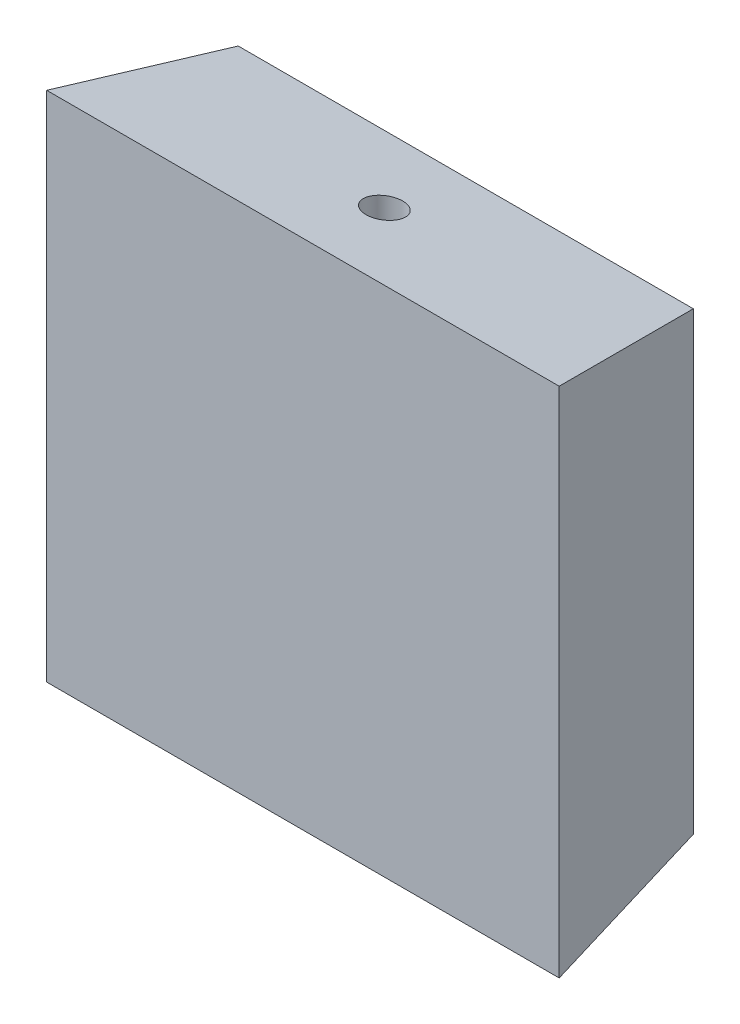
ISO-10303-21;
HEADER;
FILE_DESCRIPTION(('STEP AP214'),'2;1');
FILE_NAME('part.step','',(''),(''),'','','');
FILE_SCHEMA(('AUTOMOTIVE_DESIGN { 1 0 10303 214 1 1 1 1 }'));
ENDSEC;
DATA;
#1=APPLICATION_CONTEXT('core data for automotive mechanical design processes');
#2=APPLICATION_PROTOCOL_DEFINITION('international standard','automotive_design',2000,#1);
#3=PRODUCT_CONTEXT('',#1,'mechanical');
#4=PRODUCT('Part','Part','',(#3));
#5=PRODUCT_RELATED_PRODUCT_CATEGORY('part','',(#4));
#6=PRODUCT_DEFINITION_FORMATION('','',#4);
#7=PRODUCT_DEFINITION_CONTEXT('part definition',#1,'design');
#8=PRODUCT_DEFINITION('design','',#6,#7);
#9=PRODUCT_DEFINITION_SHAPE('','',#8);
#10=(LENGTH_UNIT() NAMED_UNIT(*) SI_UNIT(.MILLI.,.METRE.));
#11=(NAMED_UNIT(*) PLANE_ANGLE_UNIT() SI_UNIT($,.RADIAN.));
#12=(NAMED_UNIT(*) SI_UNIT($,.STERADIAN.) SOLID_ANGLE_UNIT());
#13=UNCERTAINTY_MEASURE_WITH_UNIT(LENGTH_MEASURE(1.E-05),#10,'distance_accuracy_value','');
#14=(GEOMETRIC_REPRESENTATION_CONTEXT(3) GLOBAL_UNCERTAINTY_ASSIGNED_CONTEXT((#13)) GLOBAL_UNIT_ASSIGNED_CONTEXT((#10,
#11,#12)) REPRESENTATION_CONTEXT('',''));
#15=CARTESIAN_POINT('',(0.,0.,0.));
#16=DIRECTION('',(0.,0.,1.));
#17=DIRECTION('',(1.,0.,0.));
#18=AXIS2_PLACEMENT_3D('',#15,#16,#17);
#19=CARTESIAN_POINT('',(20.701,-20.701,0.));
#20=DIRECTION('',(0.984807753012208,0.,-0.173648177666931));
#21=DIRECTION('',(-0.173648177666931,0.,-0.984807753012208));
#22=AXIS2_PLACEMENT_3D('',#19,#20,#21);
#23=PLANE('',#22);
#24=DIRECTION('',(0.,1.,0.));
#25=VECTOR('',#24,1.);
#26=CARTESIAN_POINT('',(20.701,-20.701,0.));
#27=LINE('',#26,#25);
#28=CARTESIAN_POINT('',(20.701,-20.701,0.));
#29=VERTEX_POINT('',#28);
#30=CARTESIAN_POINT('',(20.701,20.701,0.));
#31=VERTEX_POINT('',#30);
#32=EDGE_CURVE('E79',#29,#31,#27,.T.);
#33=ORIENTED_EDGE('',*,*,#32,.T.);
#34=DIRECTION('',(-0.171087869746036,-0.171087869746036,-0.970287525247814));
#35=VECTOR('',#34,1.);
#36=CARTESIAN_POINT('',(19.4891196080683,19.4891196080683,-6.87291523431365));
#37=LINE('',#36,#35);
#38=CARTESIAN_POINT('',(23.3134288073201,23.3134288073201,14.81582));
#39=VERTEX_POINT('',#38);
#40=EDGE_CURVE('E11',#39,#31,#37,.T.);
#41=ORIENTED_EDGE('',*,*,#40,.F.);
#42=DIRECTION('',(0.,-1.,0.));
#43=VECTOR('',#42,1.);
#44=CARTESIAN_POINT('',(23.3134288073201,0.,14.81582));
#45=LINE('',#44,#43);
#46=CARTESIAN_POINT('',(23.3134288073201,-23.3134288073201,14.81582));
#47=VERTEX_POINT('',#46);
#48=EDGE_CURVE('E98',#47,#39,#45,.F.);
#49=ORIENTED_EDGE('',*,*,#48,.F.);
#50=DIRECTION('',(-0.171087869746036,0.171087869746036,-0.970287525247814));
#51=VECTOR('',#50,1.);
#52=CARTESIAN_POINT('',(20.701,-20.701,0.));
#53=LINE('',#52,#51);
#54=EDGE_CURVE('E90',#47,#29,#53,.T.);
#55=ORIENTED_EDGE('',*,*,#54,.T.);
#56=EDGE_LOOP('',(#33,#41,#49,#55));
#57=FACE_BOUND('',#56,.T.);
#58=ADVANCED_FACE('F32',(#57),#23,.T.);
#59=CARTESIAN_POINT('',(-20.701,20.701,0.));
#60=DIRECTION('',(0.,0.984807753012208,-0.173648177666931));
#61=DIRECTION('',(0.,0.173648177666931,0.984807753012208));
#62=AXIS2_PLACEMENT_3D('',#59,#60,#61);
#63=PLANE('',#62);
#64=CARTESIAN_POINT('',(0.,22.00721440366,7.40791));
#65=DIRECTION('',(0.,0.984807753012208,-0.173648177666931));
#66=DIRECTION('',(0.,0.173648177666931,0.984807753012208));
#67=AXIS2_PLACEMENT_3D('',#64,#65,#66);
#68=ELLIPSE('',#67,1.69258923368705,1.666875);
#69=CARTESIAN_POINT('',(0.,22.3011294396285,9.074785));
#70=VERTEX_POINT('',#69);
#71=EDGE_CURVE('E36',#70,#70,#68,.F.);
#72=ORIENTED_EDGE('',*,*,#71,.T.);
#73=EDGE_LOOP('',(#72));
#74=FACE_BOUND('',#73,.T.);
#75=DIRECTION('',(-1.,0.,0.));
#76=VECTOR('',#75,1.);
#77=CARTESIAN_POINT('',(-20.701,20.701,0.));
#78=LINE('',#77,#76);
#79=CARTESIAN_POINT('',(-20.701,20.701,0.));
#80=VERTEX_POINT('',#79);
#81=EDGE_CURVE('E75',#31,#80,#78,.T.);
#82=ORIENTED_EDGE('',*,*,#81,.T.);
#83=DIRECTION('',(0.171087869746036,-0.171087869746036,-0.970287525247814));
#84=VECTOR('',#83,1.);
#85=CARTESIAN_POINT('',(-19.4891196080683,19.4891196080683,-6.87291523431365));
#86=LINE('',#85,#84);
#87=CARTESIAN_POINT('',(-23.3134288073201,23.3134288073201,14.81582));
#88=VERTEX_POINT('',#87);
#89=EDGE_CURVE('E41',#88,#80,#86,.T.);
#90=ORIENTED_EDGE('',*,*,#89,.F.);
#91=DIRECTION('',(1.,0.,0.));
#92=VECTOR('',#91,1.);
#93=CARTESIAN_POINT('',(0.,23.3134288073201,14.81582));
#94=LINE('',#93,#92);
#95=EDGE_CURVE('E86',#39,#88,#94,.F.);
#96=ORIENTED_EDGE('',*,*,#95,.F.);
#97=ORIENTED_EDGE('',*,*,#40,.T.);
#98=EDGE_LOOP('',(#82,#90,#96,#97));
#99=FACE_BOUND('',#98,.T.);
#100=ADVANCED_FACE('F34',(#74,#99),#63,.T.);
#101=CARTESIAN_POINT('',(-20.701,-20.701,0.));
#102=DIRECTION('',(-0.984807753012208,0.,-0.173648177666931));
#103=DIRECTION('',(-0.173648177666931,0.,0.984807753012208));
#104=AXIS2_PLACEMENT_3D('',#101,#102,#103);
#105=PLANE('',#104);
#106=DIRECTION('',(0.,-1.,0.));
#107=VECTOR('',#106,1.);
#108=CARTESIAN_POINT('',(-20.701,-20.701,0.));
#109=LINE('',#108,#107);
#110=CARTESIAN_POINT('',(-20.701,-20.701,0.));
#111=VERTEX_POINT('',#110);
#112=EDGE_CURVE('E80',#80,#111,#109,.T.);
#113=ORIENTED_EDGE('',*,*,#112,.T.);
#114=DIRECTION('',(0.171087869746036,0.171087869746036,-0.970287525247814));
#115=VECTOR('',#114,1.);
#116=CARTESIAN_POINT('',(-20.701,-20.701,0.));
#117=LINE('',#116,#115);
#118=CARTESIAN_POINT('',(-23.3134288073201,-23.3134288073201,14.81582));
#119=VERTEX_POINT('',#118);
#120=EDGE_CURVE('E101',#119,#111,#117,.T.);
#121=ORIENTED_EDGE('',*,*,#120,.F.);
#122=DIRECTION('',(0.,1.,0.));
#123=VECTOR('',#122,1.);
#124=CARTESIAN_POINT('',(-23.3134288073201,0.,14.81582));
#125=LINE('',#124,#123);
#126=EDGE_CURVE('E54',#88,#119,#125,.F.);
#127=ORIENTED_EDGE('',*,*,#126,.F.);
#128=ORIENTED_EDGE('',*,*,#89,.T.);
#129=EDGE_LOOP('',(#113,#121,#127,#128));
#130=FACE_BOUND('',#129,.T.);
#131=ADVANCED_FACE('F109',(#130),#105,.T.);
#132=CARTESIAN_POINT('',(-20.701,-20.701,0.));
#133=DIRECTION('',(0.,-0.984807753012208,-0.173648177666931));
#134=DIRECTION('',(0.,0.173648177666931,-0.984807753012208));
#135=AXIS2_PLACEMENT_3D('',#132,#133,#134);
#136=PLANE('',#135);
#137=DIRECTION('',(1.,0.,0.));
#138=VECTOR('',#137,1.);
#139=CARTESIAN_POINT('',(-20.701,-20.701,0.));
#140=LINE('',#139,#138);
#141=EDGE_CURVE('E97',#111,#29,#140,.T.);
#142=ORIENTED_EDGE('',*,*,#141,.T.);
#143=ORIENTED_EDGE('',*,*,#54,.F.);
#144=DIRECTION('',(-1.,0.,0.));
#145=VECTOR('',#144,1.);
#146=CARTESIAN_POINT('',(0.,-23.3134288073201,14.81582));
#147=LINE('',#146,#145);
#148=EDGE_CURVE('E49',#119,#47,#147,.F.);
#149=ORIENTED_EDGE('',*,*,#148,.F.);
#150=ORIENTED_EDGE('',*,*,#120,.T.);
#151=EDGE_LOOP('',(#142,#143,#149,#150));
#152=FACE_BOUND('',#151,.T.);
#153=ADVANCED_FACE('F111',(#152),#136,.T.);
#154=CARTESIAN_POINT('',(0.,0.,14.81582));
#155=DIRECTION('',(0.,0.,-1.));
#156=DIRECTION('',(-1.,0.,0.));
#157=AXIS2_PLACEMENT_3D('',#154,#155,#156);
#158=PLANE('',#157);
#159=ORIENTED_EDGE('',*,*,#48,.T.);
#160=ORIENTED_EDGE('',*,*,#95,.T.);
#161=ORIENTED_EDGE('',*,*,#126,.T.);
#162=ORIENTED_EDGE('',*,*,#148,.T.);
#163=EDGE_LOOP('',(#159,#160,#161,#162));
#164=FACE_BOUND('',#163,.T.);
#165=ADVANCED_FACE('F107',(#164),#158,.F.);
#166=CARTESIAN_POINT('',(0.,0.,0.));
#167=DIRECTION('',(0.,0.,-1.));
#168=DIRECTION('',(-1.,0.,0.));
#169=AXIS2_PLACEMENT_3D('',#166,#167,#168);
#170=PLANE('',#169);
#171=ORIENTED_EDGE('',*,*,#32,.F.);
#172=ORIENTED_EDGE('',*,*,#141,.F.);
#173=ORIENTED_EDGE('',*,*,#112,.F.);
#174=ORIENTED_EDGE('',*,*,#81,.F.);
#175=EDGE_LOOP('',(#171,#172,#173,#174));
#176=FACE_BOUND('',#175,.T.);
#177=ADVANCED_FACE('F76',(#176),#170,.T.);
#178=CARTESIAN_POINT('',(0.,12.7,7.40791));
#179=DIRECTION('',(0.,1.,0.));
#180=DIRECTION('',(0.,0.,1.));
#181=AXIS2_PLACEMENT_3D('',#178,#179,#180);
#182=CYLINDRICAL_SURFACE('',#181,1.666875);
#183=CARTESIAN_POINT('',(0.,12.7,7.40791));
#184=DIRECTION('',(0.,1.,0.));
#185=DIRECTION('',(0.,0.,1.));
#186=AXIS2_PLACEMENT_3D('',#183,#184,#185);
#187=CIRCLE('',#186,1.666875);
#188=CARTESIAN_POINT('',(0.,12.7,9.074785));
#189=VERTEX_POINT('',#188);
#190=EDGE_CURVE('E93',#189,#189,#187,.T.);
#191=ORIENTED_EDGE('',*,*,#190,.F.);
#192=EDGE_LOOP('',(#191));
#193=FACE_BOUND('',#192,.T.);
#194=ORIENTED_EDGE('',*,*,#71,.F.);
#195=EDGE_LOOP('',(#194));
#196=FACE_BOUND('',#195,.T.);
#197=ADVANCED_FACE('F127',(#193,#196),#182,.F.);
#198=CARTESIAN_POINT('',(0.,12.7,0.));
#199=DIRECTION('',(0.,1.,0.));
#200=DIRECTION('',(0.,0.,1.));
#201=AXIS2_PLACEMENT_3D('',#198,#199,#200);
#202=PLANE('',#201);
#203=ORIENTED_EDGE('',*,*,#190,.T.);
#204=EDGE_LOOP('',(#203));
#205=FACE_BOUND('',#204,.T.);
#206=ADVANCED_FACE('F131',(#205),#202,.T.);
#207=CLOSED_SHELL('',(#58,#100,#131,#153,#165,#177,#197,#206));
#208=MANIFOLD_SOLID_BREP('B2',#207);
#209=ADVANCED_BREP_SHAPE_REPRESENTATION('',(#18,#208),#14);
#210=SHAPE_DEFINITION_REPRESENTATION(#9,#209);
ENDSEC;
END-ISO-10303-21;
